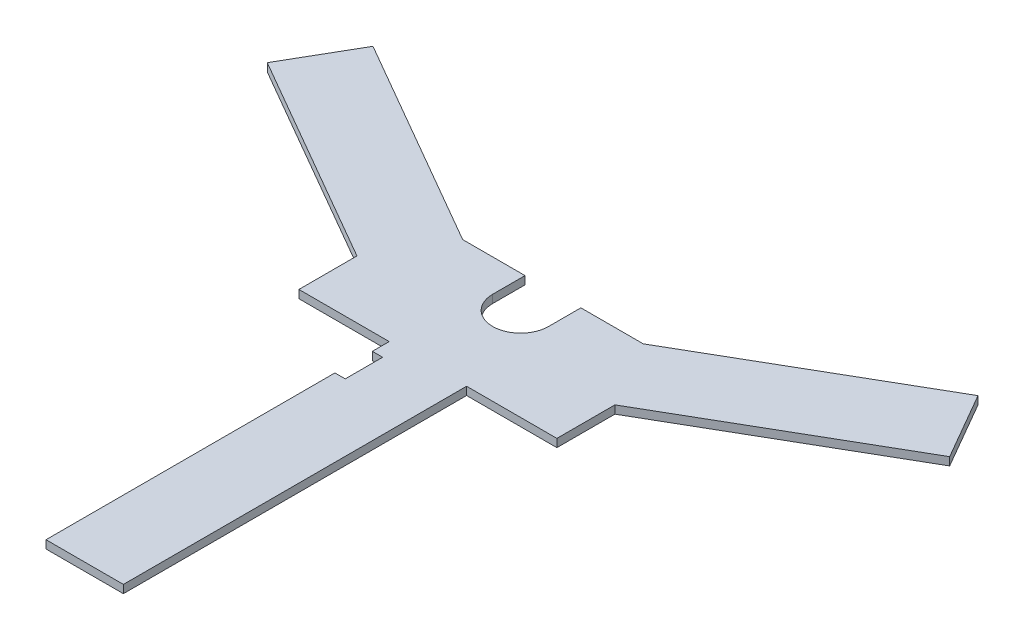
ISO-10303-21;
HEADER;
FILE_DESCRIPTION(('STEP AP214'),'2;1');
FILE_NAME('part.step','',(''),(''),'','','');
FILE_SCHEMA(('AUTOMOTIVE_DESIGN { 1 0 10303 214 1 1 1 1 }'));
ENDSEC;
DATA;
#1=APPLICATION_CONTEXT('core data for automotive mechanical design processes');
#2=APPLICATION_PROTOCOL_DEFINITION('international standard','automotive_design',2000,#1);
#3=PRODUCT_CONTEXT('',#1,'mechanical');
#4=PRODUCT('Part','Part','',(#3));
#5=PRODUCT_RELATED_PRODUCT_CATEGORY('part','',(#4));
#6=PRODUCT_DEFINITION_FORMATION('','',#4);
#7=PRODUCT_DEFINITION_CONTEXT('part definition',#1,'design');
#8=PRODUCT_DEFINITION('design','',#6,#7);
#9=PRODUCT_DEFINITION_SHAPE('','',#8);
#10=(LENGTH_UNIT() NAMED_UNIT(*) SI_UNIT(.MILLI.,.METRE.));
#11=(NAMED_UNIT(*) PLANE_ANGLE_UNIT() SI_UNIT($,.RADIAN.));
#12=(NAMED_UNIT(*) SI_UNIT($,.STERADIAN.) SOLID_ANGLE_UNIT());
#13=UNCERTAINTY_MEASURE_WITH_UNIT(LENGTH_MEASURE(1.E-05),#10,'distance_accuracy_value','');
#14=(GEOMETRIC_REPRESENTATION_CONTEXT(3) GLOBAL_UNCERTAINTY_ASSIGNED_CONTEXT((#13)) GLOBAL_UNIT_ASSIGNED_CONTEXT((#10,
#11,#12)) REPRESENTATION_CONTEXT('',''));
#15=CARTESIAN_POINT('',(0.,0.,0.));
#16=DIRECTION('',(0.,0.,1.));
#17=DIRECTION('',(1.,0.,0.));
#18=AXIS2_PLACEMENT_3D('',#15,#16,#17);
#19=CARTESIAN_POINT('',(17.78,1.5875,0.));
#20=DIRECTION('',(1.,0.,0.));
#21=DIRECTION('',(0.,0.,-1.));
#22=AXIS2_PLACEMENT_3D('',#19,#20,#21);
#23=PLANE('',#22);
#24=DIRECTION('',(0.,0.,1.));
#25=VECTOR('',#24,1.);
#26=CARTESIAN_POINT('',(17.78,1.5875,0.));
#27=LINE('',#26,#25);
#28=CARTESIAN_POINT('',(17.78,1.5875,10.6918787349666));
#29=VERTEX_POINT('',#28);
#30=CARTESIAN_POINT('',(17.78,1.5875,67.5878787349666));
#31=VERTEX_POINT('',#30);
#32=EDGE_CURVE('E401',#29,#31,#27,.T.);
#33=ORIENTED_EDGE('',*,*,#32,.F.);
#34=DIRECTION('',(0.,-1.,0.));
#35=VECTOR('',#34,1.);
#36=CARTESIAN_POINT('',(17.78,2.54,10.6918787349666));
#37=LINE('',#36,#35);
#38=CARTESIAN_POINT('',(17.78,0.,10.6918787349666));
#39=VERTEX_POINT('',#38);
#40=EDGE_CURVE('E385',#29,#39,#37,.T.);
#41=ORIENTED_EDGE('',*,*,#40,.T.);
#42=DIRECTION('',(0.,0.,1.));
#43=VECTOR('',#42,1.);
#44=CARTESIAN_POINT('',(17.78,0.,0.));
#45=LINE('',#44,#43);
#46=CARTESIAN_POINT('',(17.78,0.,67.5878787349666));
#47=VERTEX_POINT('',#46);
#48=EDGE_CURVE('E210',#39,#47,#45,.T.);
#49=ORIENTED_EDGE('',*,*,#48,.T.);
#50=DIRECTION('',(0.,-1.,0.));
#51=VECTOR('',#50,1.);
#52=CARTESIAN_POINT('',(17.78,1.5875,67.5878787349666));
#53=LINE('',#52,#51);
#54=EDGE_CURVE('E45',#31,#47,#53,.T.);
#55=ORIENTED_EDGE('',*,*,#54,.F.);
#56=EDGE_LOOP('',(#33,#41,#49,#55));
#57=FACE_BOUND('',#56,.T.);
#58=ADVANCED_FACE('F37',(#57),#23,.F.);
#59=CARTESIAN_POINT('',(0.,1.5875,0.));
#60=DIRECTION('',(0.,0.,-1.));
#61=DIRECTION('',(-1.,0.,0.));
#62=AXIS2_PLACEMENT_3D('',#59,#60,#61);
#63=PLANE('',#62);
#64=DIRECTION('',(1.,0.,0.));
#65=VECTOR('',#64,1.);
#66=CARTESIAN_POINT('',(0.,0.,0.));
#67=LINE('',#66,#65);
#68=CARTESIAN_POINT('',(0.,0.,0.));
#69=VERTEX_POINT('',#68);
#70=CARTESIAN_POINT('',(17.78,0.,0.));
#71=VERTEX_POINT('',#70);
#72=EDGE_CURVE('E208',#69,#71,#67,.T.);
#73=ORIENTED_EDGE('',*,*,#72,.T.);
#74=DIRECTION('',(0.,-1.,0.));
#75=VECTOR('',#74,1.);
#76=CARTESIAN_POINT('',(17.78,1.5875,0.));
#77=LINE('',#76,#75);
#78=CARTESIAN_POINT('',(17.78,1.5875,0.));
#79=VERTEX_POINT('',#78);
#80=EDGE_CURVE('E11',#79,#71,#77,.T.);
#81=ORIENTED_EDGE('',*,*,#80,.F.);
#82=DIRECTION('',(1.,0.,0.));
#83=VECTOR('',#82,1.);
#84=CARTESIAN_POINT('',(0.,1.5875,0.));
#85=LINE('',#84,#83);
#86=CARTESIAN_POINT('',(0.,1.5875,0.));
#87=VERTEX_POINT('',#86);
#88=EDGE_CURVE('E255',#87,#79,#85,.T.);
#89=ORIENTED_EDGE('',*,*,#88,.F.);
#90=DIRECTION('',(0.,-1.,0.));
#91=VECTOR('',#90,1.);
#92=CARTESIAN_POINT('',(0.,1.5875,0.));
#93=LINE('',#92,#91);
#94=EDGE_CURVE('E61',#87,#69,#93,.T.);
#95=ORIENTED_EDGE('',*,*,#94,.T.);
#96=EDGE_LOOP('',(#73,#81,#89,#95));
#97=FACE_BOUND('',#96,.T.);
#98=ADVANCED_FACE('F361',(#97),#63,.F.);
#99=CARTESIAN_POINT('',(17.78,0.,3.32587873496664));
#100=VERTEX_POINT('',#99);
#101=EDGE_CURVE('E213',#71,#100,#45,.T.);
#102=ORIENTED_EDGE('',*,*,#101,.T.);
#103=DIRECTION('',(0.,-1.,0.));
#104=VECTOR('',#103,1.);
#105=CARTESIAN_POINT('',(17.78,2.54,3.32587873496664));
#106=LINE('',#105,#104);
#107=CARTESIAN_POINT('',(17.78,1.5875,3.32587873496664));
#108=VERTEX_POINT('',#107);
#109=EDGE_CURVE('E52',#108,#100,#106,.T.);
#110=ORIENTED_EDGE('',*,*,#109,.F.);
#111=EDGE_CURVE('E129',#79,#108,#27,.T.);
#112=ORIENTED_EDGE('',*,*,#111,.F.);
#113=ORIENTED_EDGE('',*,*,#80,.T.);
#114=EDGE_LOOP('',(#102,#110,#112,#113));
#115=FACE_BOUND('',#114,.T.);
#116=ADVANCED_FACE('F39',(#115),#23,.F.);
#117=CARTESIAN_POINT('',(0.,1.5875,67.5878787349666));
#118=DIRECTION('',(0.,0.,-1.));
#119=DIRECTION('',(-1.,0.,0.));
#120=AXIS2_PLACEMENT_3D('',#117,#118,#119);
#121=PLANE('',#120);
#122=DIRECTION('',(1.,0.,0.));
#123=VECTOR('',#122,1.);
#124=CARTESIAN_POINT('',(0.,0.,67.5878787349666));
#125=LINE('',#124,#123);
#126=CARTESIAN_POINT('',(33.02,0.,67.5878787349666));
#127=VERTEX_POINT('',#126);
#128=EDGE_CURVE('E216',#47,#127,#125,.T.);
#129=ORIENTED_EDGE('',*,*,#128,.T.);
#130=DIRECTION('',(0.,-1.,0.));
#131=VECTOR('',#130,1.);
#132=CARTESIAN_POINT('',(33.02,1.5875,67.5878787349666));
#133=LINE('',#132,#131);
#134=CARTESIAN_POINT('',(33.02,1.5875,67.5878787349666));
#135=VERTEX_POINT('',#134);
#136=EDGE_CURVE('E283',#135,#127,#133,.T.);
#137=ORIENTED_EDGE('',*,*,#136,.F.);
#138=DIRECTION('',(1.,0.,0.));
#139=VECTOR('',#138,1.);
#140=CARTESIAN_POINT('',(0.,1.5875,67.5878787349666));
#141=LINE('',#140,#139);
#142=EDGE_CURVE('E291',#31,#135,#141,.T.);
#143=ORIENTED_EDGE('',*,*,#142,.F.);
#144=ORIENTED_EDGE('',*,*,#54,.T.);
#145=EDGE_LOOP('',(#129,#137,#143,#144));
#146=FACE_BOUND('',#145,.T.);
#147=ADVANCED_FACE('F289',(#146),#121,.F.);
#148=CARTESIAN_POINT('',(33.02,1.5875,0.));
#149=DIRECTION('',(1.,0.,0.));
#150=DIRECTION('',(0.,0.,-1.));
#151=AXIS2_PLACEMENT_3D('',#148,#149,#150);
#152=PLANE('',#151);
#153=DIRECTION('',(0.,0.,1.));
#154=VECTOR('',#153,1.);
#155=CARTESIAN_POINT('',(33.02,0.,0.));
#156=LINE('',#155,#154);
#157=CARTESIAN_POINT('',(33.02,0.,0.));
#158=VERTEX_POINT('',#157);
#159=EDGE_CURVE('E219',#158,#127,#156,.T.);
#160=ORIENTED_EDGE('',*,*,#159,.F.);
#161=DIRECTION('',(0.,-1.,0.));
#162=VECTOR('',#161,1.);
#163=CARTESIAN_POINT('',(33.02,1.5875,0.));
#164=LINE('',#163,#162);
#165=CARTESIAN_POINT('',(33.02,1.5875,0.));
#166=VERTEX_POINT('',#165);
#167=EDGE_CURVE('E281',#166,#158,#164,.T.);
#168=ORIENTED_EDGE('',*,*,#167,.F.);
#169=DIRECTION('',(0.,0.,1.));
#170=VECTOR('',#169,1.);
#171=CARTESIAN_POINT('',(33.02,1.5875,0.));
#172=LINE('',#171,#170);
#173=EDGE_CURVE('E307',#166,#135,#172,.T.);
#174=ORIENTED_EDGE('',*,*,#173,.T.);
#175=ORIENTED_EDGE('',*,*,#136,.T.);
#176=EDGE_LOOP('',(#160,#168,#174,#175));
#177=FACE_BOUND('',#176,.T.);
#178=ADVANCED_FACE('F303',(#177),#152,.T.);
#179=CARTESIAN_POINT('',(50.8,0.,0.));
#180=VERTEX_POINT('',#179);
#181=EDGE_CURVE('E212',#158,#180,#67,.T.);
#182=ORIENTED_EDGE('',*,*,#181,.T.);
#183=DIRECTION('',(0.,-1.,0.));
#184=VECTOR('',#183,1.);
#185=CARTESIAN_POINT('',(50.8,1.5875,0.));
#186=LINE('',#185,#184);
#187=CARTESIAN_POINT('',(50.8,1.5875,0.));
#188=VERTEX_POINT('',#187);
#189=EDGE_CURVE('E278',#188,#180,#186,.T.);
#190=ORIENTED_EDGE('',*,*,#189,.F.);
#191=EDGE_CURVE('E308',#166,#188,#85,.T.);
#192=ORIENTED_EDGE('',*,*,#191,.F.);
#193=ORIENTED_EDGE('',*,*,#167,.T.);
#194=EDGE_LOOP('',(#182,#190,#192,#193));
#195=FACE_BOUND('',#194,.T.);
#196=ADVANCED_FACE('F366',(#195),#63,.F.);
#197=CARTESIAN_POINT('',(50.8,1.5875,0.));
#198=DIRECTION('',(-1.,0.,0.));
#199=DIRECTION('',(0.,0.,1.));
#200=AXIS2_PLACEMENT_3D('',#197,#198,#199);
#201=PLANE('',#200);
#202=DIRECTION('',(0.,0.,-1.));
#203=VECTOR('',#202,1.);
#204=CARTESIAN_POINT('',(50.8,0.,0.));
#205=LINE('',#204,#203);
#206=CARTESIAN_POINT('',(50.8,0.,-11.43));
#207=VERTEX_POINT('',#206);
#208=EDGE_CURVE('E222',#180,#207,#205,.T.);
#209=ORIENTED_EDGE('',*,*,#208,.T.);
#210=DIRECTION('',(0.,-1.,0.));
#211=VECTOR('',#210,1.);
#212=CARTESIAN_POINT('',(50.8,1.5875,-11.43));
#213=LINE('',#212,#211);
#214=CARTESIAN_POINT('',(50.8,1.5875,-11.43));
#215=VERTEX_POINT('',#214);
#216=EDGE_CURVE('E275',#215,#207,#213,.T.);
#217=ORIENTED_EDGE('',*,*,#216,.F.);
#218=DIRECTION('',(0.,0.,-1.));
#219=VECTOR('',#218,1.);
#220=CARTESIAN_POINT('',(50.8,1.5875,0.));
#221=LINE('',#220,#219);
#222=EDGE_CURVE('E310',#188,#215,#221,.T.);
#223=ORIENTED_EDGE('',*,*,#222,.F.);
#224=ORIENTED_EDGE('',*,*,#189,.T.);
#225=EDGE_LOOP('',(#209,#217,#223,#224));
#226=FACE_BOUND('',#225,.T.);
#227=ADVANCED_FACE('F507',(#226),#201,.F.);
#228=CARTESIAN_POINT('',(7.75066481737195,1.5875,13.4245452561248));
#229=DIRECTION('',(-0.5,0.,-0.866025403784438));
#230=DIRECTION('',(-0.866025403784438,0.,0.500000000000001));
#231=AXIS2_PLACEMENT_3D('',#228,#229,#230);
#232=PLANE('',#231);
#233=DIRECTION('',(0.866025403784438,0.,-0.5));
#234=VECTOR('',#233,1.);
#235=CARTESIAN_POINT('',(7.75066481737195,0.,13.4245452561248));
#236=LINE('',#235,#234);
#237=CARTESIAN_POINT('',(92.594385986637,0.,-35.56));
#238=VERTEX_POINT('',#237);
#239=EDGE_CURVE('E224',#207,#238,#236,.T.);
#240=ORIENTED_EDGE('',*,*,#239,.T.);
#241=DIRECTION('',(0.,-1.,0.));
#242=VECTOR('',#241,1.);
#243=CARTESIAN_POINT('',(92.594385986637,1.5875,-35.56));
#244=LINE('',#243,#242);
#245=CARTESIAN_POINT('',(92.594385986637,1.5875,-35.56));
#246=VERTEX_POINT('',#245);
#247=EDGE_CURVE('E273',#246,#238,#244,.T.);
#248=ORIENTED_EDGE('',*,*,#247,.F.);
#249=DIRECTION('',(0.866025403784438,0.,-0.5));
#250=VECTOR('',#249,1.);
#251=CARTESIAN_POINT('',(7.75066481737195,1.5875,13.4245452561248));
#252=LINE('',#251,#250);
#253=EDGE_CURVE('E316',#215,#246,#252,.T.);
#254=ORIENTED_EDGE('',*,*,#253,.F.);
#255=ORIENTED_EDGE('',*,*,#216,.T.);
#256=EDGE_LOOP('',(#240,#248,#254,#255));
#257=FACE_BOUND('',#256,.T.);
#258=ADVANCED_FACE('F518',(#257),#232,.F.);
#259=CARTESIAN_POINT('',(84.843721169265,1.5875,-48.9845452561249));
#260=DIRECTION('',(0.866025403784437,0.,-0.500000000000002));
#261=DIRECTION('',(-0.500000000000002,0.,-0.866025403784438));
#262=AXIS2_PLACEMENT_3D('',#259,#260,#261);
#263=PLANE('',#262);
#264=DIRECTION('',(0.500000000000002,0.,0.866025403784438));
#265=VECTOR('',#264,1.);
#266=CARTESIAN_POINT('',(84.843721169265,0.,-48.9845452561249));
#267=LINE('',#266,#265);
#268=CARTESIAN_POINT('',(84.9743859866369,0.,-48.758227153675));
#269=VERTEX_POINT('',#268);
#270=EDGE_CURVE('E227',#269,#238,#267,.T.);
#271=ORIENTED_EDGE('',*,*,#270,.F.);
#272=DIRECTION('',(0.,-1.,0.));
#273=VECTOR('',#272,1.);
#274=CARTESIAN_POINT('',(84.9743859866369,1.5875,-48.758227153675));
#275=LINE('',#274,#273);
#276=CARTESIAN_POINT('',(84.9743859866369,1.5875,-48.758227153675));
#277=VERTEX_POINT('',#276);
#278=EDGE_CURVE('E271',#277,#269,#275,.T.);
#279=ORIENTED_EDGE('',*,*,#278,.F.);
#280=DIRECTION('',(0.500000000000002,0.,0.866025403784438));
#281=VECTOR('',#280,1.);
#282=CARTESIAN_POINT('',(84.843721169265,1.5875,-48.9845452561249));
#283=LINE('',#282,#281);
#284=EDGE_CURVE('E318',#277,#246,#283,.T.);
#285=ORIENTED_EDGE('',*,*,#284,.T.);
#286=ORIENTED_EDGE('',*,*,#247,.T.);
#287=EDGE_LOOP('',(#271,#279,#285,#286));
#288=FACE_BOUND('',#287,.T.);
#289=ADVANCED_FACE('F527',(#288),#263,.T.);
#290=CARTESIAN_POINT('',(0.130664817372036,1.5875,0.226318102450073));
#291=DIRECTION('',(-0.500000000000004,0.,-0.866025403784436));
#292=DIRECTION('',(-0.866025403784437,0.,0.500000000000004));
#293=AXIS2_PLACEMENT_3D('',#290,#291,#292);
#294=PLANE('',#293);
#295=DIRECTION('',(0.866025403784437,0.,-0.500000000000004));
#296=VECTOR('',#295,1.);
#297=CARTESIAN_POINT('',(0.130664817372036,0.,0.226318102450073));
#298=LINE('',#297,#296);
#299=CARTESIAN_POINT('',(43.18,0.,-24.6282271536748));
#300=VERTEX_POINT('',#299);
#301=EDGE_CURVE('E230',#300,#269,#298,.T.);
#302=ORIENTED_EDGE('',*,*,#301,.F.);
#303=DIRECTION('',(0.,-1.,0.));
#304=VECTOR('',#303,1.);
#305=CARTESIAN_POINT('',(43.18,1.5875,-24.6282271536748));
#306=LINE('',#305,#304);
#307=CARTESIAN_POINT('',(43.18,1.5875,-24.6282271536748));
#308=VERTEX_POINT('',#307);
#309=EDGE_CURVE('E269',#308,#300,#306,.T.);
#310=ORIENTED_EDGE('',*,*,#309,.F.);
#311=DIRECTION('',(0.866025403784437,0.,-0.500000000000004));
#312=VECTOR('',#311,1.);
#313=CARTESIAN_POINT('',(0.130664817372036,1.5875,0.226318102450073));
#314=LINE('',#313,#312);
#315=EDGE_CURVE('E321',#308,#277,#314,.T.);
#316=ORIENTED_EDGE('',*,*,#315,.T.);
#317=ORIENTED_EDGE('',*,*,#278,.T.);
#318=EDGE_LOOP('',(#302,#310,#316,#317));
#319=FACE_BOUND('',#318,.T.);
#320=ADVANCED_FACE('F536',(#319),#294,.T.);
#321=CARTESIAN_POINT('',(0.,1.5875,-24.6282271536748));
#322=DIRECTION('',(0.,0.,-1.));
#323=DIRECTION('',(-1.,0.,0.));
#324=AXIS2_PLACEMENT_3D('',#321,#322,#323);
#325=PLANE('',#324);
#326=DIRECTION('',(1.,0.,0.));
#327=VECTOR('',#326,1.);
#328=CARTESIAN_POINT('',(0.,0.,-24.6282271536748));
#329=LINE('',#328,#327);
#330=CARTESIAN_POINT('',(30.9,0.,-24.6282271536748));
#331=VERTEX_POINT('',#330);
#332=EDGE_CURVE('E233',#331,#300,#329,.T.);
#333=ORIENTED_EDGE('',*,*,#332,.F.);
#334=DIRECTION('',(0.,-1.,0.));
#335=VECTOR('',#334,1.);
#336=CARTESIAN_POINT('',(30.9,1.5875,-24.6282271536748));
#337=LINE('',#336,#335);
#338=CARTESIAN_POINT('',(30.9,1.5875,-24.6282271536748));
#339=VERTEX_POINT('',#338);
#340=EDGE_CURVE('E267',#339,#331,#337,.T.);
#341=ORIENTED_EDGE('',*,*,#340,.F.);
#342=DIRECTION('',(1.,0.,0.));
#343=VECTOR('',#342,1.);
#344=CARTESIAN_POINT('',(0.,1.5875,-24.6282271536748));
#345=LINE('',#344,#343);
#346=EDGE_CURVE('E324',#339,#308,#345,.T.);
#347=ORIENTED_EDGE('',*,*,#346,.T.);
#348=ORIENTED_EDGE('',*,*,#309,.T.);
#349=EDGE_LOOP('',(#333,#341,#347,#348));
#350=FACE_BOUND('',#349,.T.);
#351=ADVANCED_FACE('F359',(#350),#325,.T.);
#352=CARTESIAN_POINT('',(30.9,1.5875,0.));
#353=DIRECTION('',(-1.,0.,0.));
#354=DIRECTION('',(0.,0.,1.));
#355=AXIS2_PLACEMENT_3D('',#352,#353,#354);
#356=PLANE('',#355);
#357=DIRECTION('',(0.,0.,-1.));
#358=VECTOR('',#357,1.);
#359=CARTESIAN_POINT('',(30.9,0.,0.));
#360=LINE('',#359,#358);
#361=CARTESIAN_POINT('',(30.9,0.,-18.2641212650333));
#362=VERTEX_POINT('',#361);
#363=EDGE_CURVE('E236',#362,#331,#360,.T.);
#364=ORIENTED_EDGE('',*,*,#363,.F.);
#365=DIRECTION('',(0.,-1.,0.));
#366=VECTOR('',#365,1.);
#367=CARTESIAN_POINT('',(30.9,1.5875,-18.2641212650333));
#368=LINE('',#367,#366);
#369=CARTESIAN_POINT('',(30.9,1.5875,-18.2641212650333));
#370=VERTEX_POINT('',#369);
#371=EDGE_CURVE('E265',#370,#362,#368,.T.);
#372=ORIENTED_EDGE('',*,*,#371,.F.);
#373=DIRECTION('',(0.,0.,-1.));
#374=VECTOR('',#373,1.);
#375=CARTESIAN_POINT('',(30.9,1.5875,0.));
#376=LINE('',#375,#374);
#377=EDGE_CURVE('E327',#370,#339,#376,.T.);
#378=ORIENTED_EDGE('',*,*,#377,.T.);
#379=ORIENTED_EDGE('',*,*,#340,.T.);
#380=EDGE_LOOP('',(#364,#372,#378,#379));
#381=FACE_BOUND('',#380,.T.);
#382=ADVANCED_FACE('F553',(#381),#356,.T.);
#383=CARTESIAN_POINT('',(25.4,1.5875,-18.2641212650333));
#384=DIRECTION('',(0.,-1.,0.));
#385=DIRECTION('',(0.,0.,-1.));
#386=AXIS2_PLACEMENT_3D('',#383,#384,#385);
#387=CYLINDRICAL_SURFACE('',#386,5.5);
#388=CARTESIAN_POINT('',(25.4,0.,-18.2641212650333));
#389=DIRECTION('',(0.,1.,0.));
#390=DIRECTION('',(0.,0.,1.));
#391=AXIS2_PLACEMENT_3D('',#388,#389,#390);
#392=CIRCLE('',#391,5.5);
#393=CARTESIAN_POINT('',(19.9,0.,-18.2641212650333));
#394=VERTEX_POINT('',#393);
#395=EDGE_CURVE('E240',#394,#362,#392,.T.);
#396=ORIENTED_EDGE('',*,*,#395,.F.);
#397=DIRECTION('',(0.,-1.,0.));
#398=VECTOR('',#397,1.);
#399=CARTESIAN_POINT('',(19.9,1.5875,-18.2641212650333));
#400=LINE('',#399,#398);
#401=CARTESIAN_POINT('',(19.9,1.5875,-18.2641212650333));
#402=VERTEX_POINT('',#401);
#403=EDGE_CURVE('E263',#402,#394,#400,.T.);
#404=ORIENTED_EDGE('',*,*,#403,.F.);
#405=CARTESIAN_POINT('',(25.4,1.5875,-18.2641212650333));
#406=DIRECTION('',(0.,1.,0.));
#407=DIRECTION('',(0.,0.,1.));
#408=AXIS2_PLACEMENT_3D('',#405,#406,#407);
#409=CIRCLE('',#408,5.5);
#410=EDGE_CURVE('E331',#402,#370,#409,.T.);
#411=ORIENTED_EDGE('',*,*,#410,.T.);
#412=ORIENTED_EDGE('',*,*,#371,.T.);
#413=EDGE_LOOP('',(#396,#404,#411,#412));
#414=FACE_BOUND('',#413,.T.);
#415=ADVANCED_FACE('F561',(#414),#387,.F.);
#416=CARTESIAN_POINT('',(19.9,1.5875,0.));
#417=DIRECTION('',(-1.,0.,0.));
#418=DIRECTION('',(0.,0.,1.));
#419=AXIS2_PLACEMENT_3D('',#416,#417,#418);
#420=PLANE('',#419);
#421=DIRECTION('',(0.,0.,-1.));
#422=VECTOR('',#421,1.);
#423=CARTESIAN_POINT('',(19.9,0.,0.));
#424=LINE('',#423,#422);
#425=CARTESIAN_POINT('',(19.9,0.,-24.6282271536748));
#426=VERTEX_POINT('',#425);
#427=EDGE_CURVE('E243',#394,#426,#424,.T.);
#428=ORIENTED_EDGE('',*,*,#427,.T.);
#429=DIRECTION('',(0.,-1.,0.));
#430=VECTOR('',#429,1.);
#431=CARTESIAN_POINT('',(19.9,1.5875,-24.6282271536748));
#432=LINE('',#431,#430);
#433=CARTESIAN_POINT('',(19.9,1.5875,-24.6282271536748));
#434=VERTEX_POINT('',#433);
#435=EDGE_CURVE('E261',#434,#426,#432,.T.);
#436=ORIENTED_EDGE('',*,*,#435,.F.);
#437=DIRECTION('',(0.,0.,-1.));
#438=VECTOR('',#437,1.);
#439=CARTESIAN_POINT('',(19.9,1.5875,0.));
#440=LINE('',#439,#438);
#441=EDGE_CURVE('E334',#402,#434,#440,.T.);
#442=ORIENTED_EDGE('',*,*,#441,.F.);
#443=ORIENTED_EDGE('',*,*,#403,.T.);
#444=EDGE_LOOP('',(#428,#436,#442,#443));
#445=FACE_BOUND('',#444,.T.);
#446=ADVANCED_FACE('F344',(#445),#420,.F.);
#447=CARTESIAN_POINT('',(7.62000000000002,0.,-24.6282271536748));
#448=VERTEX_POINT('',#447);
#449=EDGE_CURVE('E237',#448,#426,#329,.T.);
#450=ORIENTED_EDGE('',*,*,#449,.F.);
#451=DIRECTION('',(0.,-1.,0.));
#452=VECTOR('',#451,1.);
#453=CARTESIAN_POINT('',(7.62000000000002,1.5875,-24.6282271536748));
#454=LINE('',#453,#452);
#455=CARTESIAN_POINT('',(7.62000000000002,1.5875,-24.6282271536748));
#456=VERTEX_POINT('',#455);
#457=EDGE_CURVE('E259',#456,#448,#454,.T.);
#458=ORIENTED_EDGE('',*,*,#457,.F.);
#459=EDGE_CURVE('E328',#456,#434,#345,.T.);
#460=ORIENTED_EDGE('',*,*,#459,.T.);
#461=ORIENTED_EDGE('',*,*,#435,.T.);
#462=EDGE_LOOP('',(#450,#458,#460,#461));
#463=FACE_BOUND('',#462,.T.);
#464=ADVANCED_FACE('F338',(#463),#325,.T.);
#465=CARTESIAN_POINT('',(12.5693351826281,1.5875,-21.7707271536748));
#466=DIRECTION('',(-0.500000000000001,0.,0.866025403784438));
#467=DIRECTION('',(0.866025403784438,0.,0.500000000000001));
#468=AXIS2_PLACEMENT_3D('',#465,#466,#467);
#469=PLANE('',#468);
#470=DIRECTION('',(-0.866025403784438,0.,-0.500000000000001));
#471=VECTOR('',#470,1.);
#472=CARTESIAN_POINT('',(12.5693351826281,0.,-21.7707271536748));
#473=LINE('',#472,#471);
#474=CARTESIAN_POINT('',(-34.174385986637,0.,-48.7582271536749));
#475=VERTEX_POINT('',#474);
#476=EDGE_CURVE('E246',#448,#475,#473,.T.);
#477=ORIENTED_EDGE('',*,*,#476,.T.);
#478=DIRECTION('',(0.,-1.,0.));
#479=VECTOR('',#478,1.);
#480=CARTESIAN_POINT('',(-34.174385986637,1.5875,-48.7582271536749));
#481=LINE('',#480,#479);
#482=CARTESIAN_POINT('',(-34.174385986637,1.5875,-48.7582271536749));
#483=VERTEX_POINT('',#482);
#484=EDGE_CURVE('E188',#483,#475,#481,.T.);
#485=ORIENTED_EDGE('',*,*,#484,.F.);
#486=DIRECTION('',(-0.866025403784438,0.,-0.500000000000001));
#487=VECTOR('',#486,1.);
#488=CARTESIAN_POINT('',(12.5693351826281,1.5875,-21.7707271536748));
#489=LINE('',#488,#487);
#490=EDGE_CURVE('E199',#456,#483,#489,.T.);
#491=ORIENTED_EDGE('',*,*,#490,.F.);
#492=ORIENTED_EDGE('',*,*,#457,.T.);
#493=EDGE_LOOP('',(#477,#485,#491,#492));
#494=FACE_BOUND('',#493,.T.);
#495=ADVANCED_FACE('F350',(#494),#469,.F.);
#496=CARTESIAN_POINT('',(-46.7437211692651,1.5875,-26.9875000000001));
#497=DIRECTION('',(-0.866025403784438,0.,-0.500000000000001));
#498=DIRECTION('',(-0.500000000000001,0.,0.866025403784438));
#499=AXIS2_PLACEMENT_3D('',#496,#497,#498);
#500=PLANE('',#499);
#501=DIRECTION('',(0.500000000000001,0.,-0.866025403784438));
#502=VECTOR('',#501,1.);
#503=CARTESIAN_POINT('',(-46.7437211692651,0.,-26.9875000000001));
#504=LINE('',#503,#502);
#505=CARTESIAN_POINT('',(-41.794385986637,0.,-35.56));
#506=VERTEX_POINT('',#505);
#507=EDGE_CURVE('E183',#506,#475,#504,.T.);
#508=ORIENTED_EDGE('',*,*,#507,.F.);
#509=DIRECTION('',(0.,-1.,0.));
#510=VECTOR('',#509,1.);
#511=CARTESIAN_POINT('',(-41.794385986637,1.5875,-35.56));
#512=LINE('',#511,#510);
#513=CARTESIAN_POINT('',(-41.794385986637,1.5875,-35.56));
#514=VERTEX_POINT('',#513);
#515=EDGE_CURVE('E178',#514,#506,#512,.T.);
#516=ORIENTED_EDGE('',*,*,#515,.F.);
#517=DIRECTION('',(0.500000000000001,0.,-0.866025403784438));
#518=VECTOR('',#517,1.);
#519=CARTESIAN_POINT('',(-46.7437211692651,1.5875,-26.9875000000001));
#520=LINE('',#519,#518);
#521=EDGE_CURVE('E181',#514,#483,#520,.T.);
#522=ORIENTED_EDGE('',*,*,#521,.T.);
#523=ORIENTED_EDGE('',*,*,#484,.T.);
#524=EDGE_LOOP('',(#508,#516,#522,#523));
#525=FACE_BOUND('',#524,.T.);
#526=ADVANCED_FACE('F180',(#525),#500,.T.);
#527=CARTESIAN_POINT('',(4.94933518262807,1.5875,-8.57249999999999));
#528=DIRECTION('',(-0.500000000000001,0.,0.866025403784438));
#529=DIRECTION('',(0.866025403784438,0.,0.500000000000001));
#530=AXIS2_PLACEMENT_3D('',#527,#528,#529);
#531=PLANE('',#530);
#532=DIRECTION('',(-0.866025403784438,0.,-0.500000000000001));
#533=VECTOR('',#532,1.);
#534=CARTESIAN_POINT('',(4.94933518262807,0.,-8.57249999999999));
#535=LINE('',#534,#533);
#536=CARTESIAN_POINT('',(0.,0.,-11.43));
#537=VERTEX_POINT('',#536);
#538=EDGE_CURVE('E250',#537,#506,#535,.T.);
#539=ORIENTED_EDGE('',*,*,#538,.F.);
#540=DIRECTION('',(0.,-1.,0.));
#541=VECTOR('',#540,1.);
#542=CARTESIAN_POINT('',(0.,1.5875,-11.43));
#543=LINE('',#542,#541);
#544=CARTESIAN_POINT('',(0.,1.5875,-11.43));
#545=VERTEX_POINT('',#544);
#546=EDGE_CURVE('E189',#545,#537,#543,.T.);
#547=ORIENTED_EDGE('',*,*,#546,.F.);
#548=DIRECTION('',(-0.866025403784438,0.,-0.500000000000001));
#549=VECTOR('',#548,1.);
#550=CARTESIAN_POINT('',(4.94933518262807,1.5875,-8.57249999999999));
#551=LINE('',#550,#549);
#552=EDGE_CURVE('E196',#545,#514,#551,.T.);
#553=ORIENTED_EDGE('',*,*,#552,.T.);
#554=ORIENTED_EDGE('',*,*,#515,.T.);
#555=EDGE_LOOP('',(#539,#547,#553,#554));
#556=FACE_BOUND('',#555,.T.);
#557=ADVANCED_FACE('F202',(#556),#531,.T.);
#558=CARTESIAN_POINT('',(0.,1.5875,0.));
#559=DIRECTION('',(-1.,0.,0.));
#560=DIRECTION('',(0.,0.,1.));
#561=AXIS2_PLACEMENT_3D('',#558,#559,#560);
#562=PLANE('',#561);
#563=DIRECTION('',(0.,0.,-1.));
#564=VECTOR('',#563,1.);
#565=CARTESIAN_POINT('',(0.,0.,0.));
#566=LINE('',#565,#564);
#567=EDGE_CURVE('E252',#69,#537,#566,.T.);
#568=ORIENTED_EDGE('',*,*,#567,.F.);
#569=ORIENTED_EDGE('',*,*,#94,.F.);
#570=DIRECTION('',(0.,0.,-1.));
#571=VECTOR('',#570,1.);
#572=CARTESIAN_POINT('',(0.,1.5875,0.));
#573=LINE('',#572,#571);
#574=EDGE_CURVE('E203',#87,#545,#573,.T.);
#575=ORIENTED_EDGE('',*,*,#574,.T.);
#576=ORIENTED_EDGE('',*,*,#546,.T.);
#577=EDGE_LOOP('',(#568,#569,#575,#576));
#578=FACE_BOUND('',#577,.T.);
#579=ADVANCED_FACE('F429',(#578),#562,.T.);
#580=CARTESIAN_POINT('',(0.,1.5875,0.));
#581=DIRECTION('',(0.,1.,0.));
#582=DIRECTION('',(0.,0.,1.));
#583=AXIS2_PLACEMENT_3D('',#580,#581,#582);
#584=PLANE('',#583);
#585=DIRECTION('',(1.,0.,0.));
#586=VECTOR('',#585,1.);
#587=CARTESIAN_POINT('',(0.,1.5875,10.6918787349666));
#588=LINE('',#587,#586);
#589=CARTESIAN_POINT('',(19.812,1.5875,10.6918787349666));
#590=VERTEX_POINT('',#589);
#591=EDGE_CURVE('E211',#29,#590,#588,.T.);
#592=ORIENTED_EDGE('',*,*,#591,.F.);
#593=ORIENTED_EDGE('',*,*,#32,.T.);
#594=ORIENTED_EDGE('',*,*,#142,.T.);
#595=ORIENTED_EDGE('',*,*,#173,.F.);
#596=ORIENTED_EDGE('',*,*,#191,.T.);
#597=ORIENTED_EDGE('',*,*,#222,.T.);
#598=ORIENTED_EDGE('',*,*,#253,.T.);
#599=ORIENTED_EDGE('',*,*,#284,.F.);
#600=ORIENTED_EDGE('',*,*,#315,.F.);
#601=ORIENTED_EDGE('',*,*,#346,.F.);
#602=ORIENTED_EDGE('',*,*,#377,.F.);
#603=ORIENTED_EDGE('',*,*,#410,.F.);
#604=ORIENTED_EDGE('',*,*,#441,.T.);
#605=ORIENTED_EDGE('',*,*,#459,.F.);
#606=ORIENTED_EDGE('',*,*,#490,.T.);
#607=ORIENTED_EDGE('',*,*,#521,.F.);
#608=ORIENTED_EDGE('',*,*,#552,.F.);
#609=ORIENTED_EDGE('',*,*,#574,.F.);
#610=ORIENTED_EDGE('',*,*,#88,.T.);
#611=ORIENTED_EDGE('',*,*,#111,.T.);
#612=DIRECTION('',(-1.,0.,0.));
#613=VECTOR('',#612,1.);
#614=CARTESIAN_POINT('',(0.,1.5875,3.32587873496664));
#615=LINE('',#614,#613);
#616=CARTESIAN_POINT('',(19.812,1.5875,3.32587873496664));
#617=VERTEX_POINT('',#616);
#618=EDGE_CURVE('E388',#617,#108,#615,.T.);
#619=ORIENTED_EDGE('',*,*,#618,.F.);
#620=DIRECTION('',(0.,0.,-1.));
#621=VECTOR('',#620,1.);
#622=CARTESIAN_POINT('',(19.812,1.5875,0.));
#623=LINE('',#622,#621);
#624=EDGE_CURVE('E397',#590,#617,#623,.T.);
#625=ORIENTED_EDGE('',*,*,#624,.F.);
#626=EDGE_LOOP('',(#592,#593,#594,#595,#596,#597,#598,#599,#600,#601,#602,#603,#604,#605,#606,
#607,#608,#609,#610,#611,#619,#625));
#627=FACE_BOUND('',#626,.T.);
#628=ADVANCED_FACE('F194',(#627),#584,.T.);
#629=CARTESIAN_POINT('',(0.,0.,0.));
#630=DIRECTION('',(0.,1.,0.));
#631=DIRECTION('',(0.,0.,1.));
#632=AXIS2_PLACEMENT_3D('',#629,#630,#631);
#633=PLANE('',#632);
#634=ORIENTED_EDGE('',*,*,#48,.F.);
#635=DIRECTION('',(-1.,0.,0.));
#636=VECTOR('',#635,1.);
#637=CARTESIAN_POINT('',(17.78,0.,10.6918787349666));
#638=LINE('',#637,#636);
#639=CARTESIAN_POINT('',(19.812,0.,10.6918787349666));
#640=VERTEX_POINT('',#639);
#641=EDGE_CURVE('E380',#640,#39,#638,.T.);
#642=ORIENTED_EDGE('',*,*,#641,.F.);
#643=DIRECTION('',(0.,0.,1.));
#644=VECTOR('',#643,1.);
#645=CARTESIAN_POINT('',(19.812,0.,10.6918787349666));
#646=LINE('',#645,#644);
#647=CARTESIAN_POINT('',(19.812,0.,3.32587873496664));
#648=VERTEX_POINT('',#647);
#649=EDGE_CURVE('E377',#648,#640,#646,.T.);
#650=ORIENTED_EDGE('',*,*,#649,.F.);
#651=DIRECTION('',(1.,0.,0.));
#652=VECTOR('',#651,1.);
#653=CARTESIAN_POINT('',(17.78,0.,3.32587873496664));
#654=LINE('',#653,#652);
#655=EDGE_CURVE('E374',#100,#648,#654,.T.);
#656=ORIENTED_EDGE('',*,*,#655,.F.);
#657=ORIENTED_EDGE('',*,*,#101,.F.);
#658=ORIENTED_EDGE('',*,*,#72,.F.);
#659=ORIENTED_EDGE('',*,*,#567,.T.);
#660=ORIENTED_EDGE('',*,*,#538,.T.);
#661=ORIENTED_EDGE('',*,*,#507,.T.);
#662=ORIENTED_EDGE('',*,*,#476,.F.);
#663=ORIENTED_EDGE('',*,*,#449,.T.);
#664=ORIENTED_EDGE('',*,*,#427,.F.);
#665=ORIENTED_EDGE('',*,*,#395,.T.);
#666=ORIENTED_EDGE('',*,*,#363,.T.);
#667=ORIENTED_EDGE('',*,*,#332,.T.);
#668=ORIENTED_EDGE('',*,*,#301,.T.);
#669=ORIENTED_EDGE('',*,*,#270,.T.);
#670=ORIENTED_EDGE('',*,*,#239,.F.);
#671=ORIENTED_EDGE('',*,*,#208,.F.);
#672=ORIENTED_EDGE('',*,*,#181,.F.);
#673=ORIENTED_EDGE('',*,*,#159,.T.);
#674=ORIENTED_EDGE('',*,*,#128,.F.);
#675=EDGE_LOOP('',(#634,#642,#650,#656,#657,#658,#659,#660,#661,#662,#663,#664,#665,#666,#667,
#668,#669,#670,#671,#672,#673,#674));
#676=FACE_BOUND('',#675,.T.);
#677=ADVANCED_FACE('F296',(#676),#633,.F.);
#678=CARTESIAN_POINT('',(17.78,2.54,10.6918787349666));
#679=DIRECTION('',(0.,0.,1.));
#680=DIRECTION('',(1.,0.,0.));
#681=AXIS2_PLACEMENT_3D('',#678,#679,#680);
#682=PLANE('',#681);
#683=ORIENTED_EDGE('',*,*,#591,.T.);
#684=DIRECTION('',(0.,-1.,0.));
#685=VECTOR('',#684,1.);
#686=CARTESIAN_POINT('',(19.812,2.54,10.6918787349666));
#687=LINE('',#686,#685);
#688=EDGE_CURVE('E389',#590,#640,#687,.T.);
#689=ORIENTED_EDGE('',*,*,#688,.T.);
#690=ORIENTED_EDGE('',*,*,#641,.T.);
#691=ORIENTED_EDGE('',*,*,#40,.F.);
#692=EDGE_LOOP('',(#683,#689,#690,#691));
#693=FACE_BOUND('',#692,.T.);
#694=ADVANCED_FACE('F423',(#693),#682,.F.);
#695=CARTESIAN_POINT('',(19.812,2.54,10.6918787349666));
#696=DIRECTION('',(1.,0.,0.));
#697=DIRECTION('',(0.,0.,-1.));
#698=AXIS2_PLACEMENT_3D('',#695,#696,#697);
#699=PLANE('',#698);
#700=ORIENTED_EDGE('',*,*,#624,.T.);
#701=DIRECTION('',(0.,-1.,0.));
#702=VECTOR('',#701,1.);
#703=CARTESIAN_POINT('',(19.812,2.54,3.32587873496664));
#704=LINE('',#703,#702);
#705=EDGE_CURVE('E392',#617,#648,#704,.T.);
#706=ORIENTED_EDGE('',*,*,#705,.T.);
#707=ORIENTED_EDGE('',*,*,#649,.T.);
#708=ORIENTED_EDGE('',*,*,#688,.F.);
#709=EDGE_LOOP('',(#700,#706,#707,#708));
#710=FACE_BOUND('',#709,.T.);
#711=ADVANCED_FACE('F416',(#710),#699,.F.);
#712=CARTESIAN_POINT('',(17.78,2.54,3.32587873496664));
#713=DIRECTION('',(0.,0.,-1.));
#714=DIRECTION('',(-1.,0.,0.));
#715=AXIS2_PLACEMENT_3D('',#712,#713,#714);
#716=PLANE('',#715);
#717=ORIENTED_EDGE('',*,*,#618,.T.);
#718=ORIENTED_EDGE('',*,*,#109,.T.);
#719=ORIENTED_EDGE('',*,*,#655,.T.);
#720=ORIENTED_EDGE('',*,*,#705,.F.);
#721=EDGE_LOOP('',(#717,#718,#719,#720));
#722=FACE_BOUND('',#721,.T.);
#723=ADVANCED_FACE('F417',(#722),#716,.F.);
#724=CLOSED_SHELL('',(#58,#98,#116,#147,#178,#196,#227,#258,#289,#320,#351,#382,#415,#446,#464,
#495,#526,#557,#579,#628,#677,#694,#711,#723));
#725=MANIFOLD_SOLID_BREP('B2',#724);
#726=ADVANCED_BREP_SHAPE_REPRESENTATION('',(#18,#725),#14);
#727=SHAPE_DEFINITION_REPRESENTATION(#9,#726);
ENDSEC;
END-ISO-10303-21;
